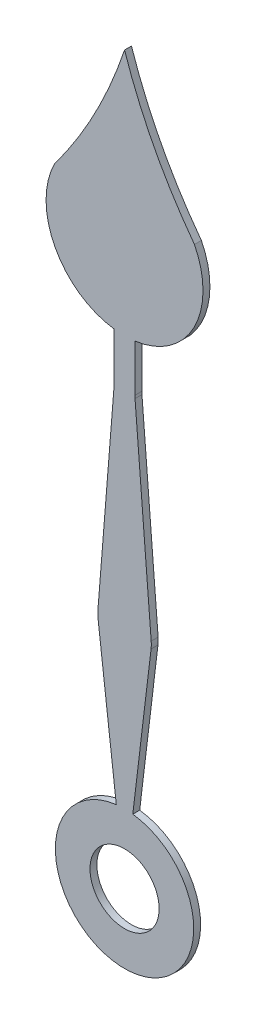
ISO-10303-21;
HEADER;
FILE_DESCRIPTION(('STEP AP214'),'2;1');
FILE_NAME('part.step','',(''),(''),'','','');
FILE_SCHEMA(('AUTOMOTIVE_DESIGN { 1 0 10303 214 1 1 1 1 }'));
ENDSEC;
DATA;
#1=APPLICATION_CONTEXT('core data for automotive mechanical design processes');
#2=APPLICATION_PROTOCOL_DEFINITION('international standard','automotive_design',2000,#1);
#3=PRODUCT_CONTEXT('',#1,'mechanical');
#4=PRODUCT('Part','Part','',(#3));
#5=PRODUCT_RELATED_PRODUCT_CATEGORY('part','',(#4));
#6=PRODUCT_DEFINITION_FORMATION('','',#4);
#7=PRODUCT_DEFINITION_CONTEXT('part definition',#1,'design');
#8=PRODUCT_DEFINITION('design','',#6,#7);
#9=PRODUCT_DEFINITION_SHAPE('','',#8);
#10=(LENGTH_UNIT() NAMED_UNIT(*) SI_UNIT(.MILLI.,.METRE.));
#11=(NAMED_UNIT(*) PLANE_ANGLE_UNIT() SI_UNIT($,.RADIAN.));
#12=(NAMED_UNIT(*) SI_UNIT($,.STERADIAN.) SOLID_ANGLE_UNIT());
#13=UNCERTAINTY_MEASURE_WITH_UNIT(LENGTH_MEASURE(1.E-05),#10,'distance_accuracy_value','');
#14=(GEOMETRIC_REPRESENTATION_CONTEXT(3) GLOBAL_UNCERTAINTY_ASSIGNED_CONTEXT((#13)) GLOBAL_UNIT_ASSIGNED_CONTEXT((#10,
#11,#12)) REPRESENTATION_CONTEXT('',''));
#15=CARTESIAN_POINT('',(0.,0.,0.));
#16=DIRECTION('',(0.,0.,1.));
#17=DIRECTION('',(1.,0.,0.));
#18=AXIS2_PLACEMENT_3D('',#15,#16,#17);
#19=CARTESIAN_POINT('',(12.9954220080142,25.3498386594847,0.2));
#20=DIRECTION('',(0.,0.,-1.));
#21=DIRECTION('',(-1.,0.,0.));
#22=AXIS2_PLACEMENT_3D('',#19,#20,#21);
#23=PLANE('',#22);
#24=CARTESIAN_POINT('',(12.9954220080142,25.3498386594847,0.2));
#25=DIRECTION('',(0.,0.,-1.));
#26=DIRECTION('',(-1.,0.,0.));
#27=AXIS2_PLACEMENT_3D('',#24,#25,#26);
#28=CIRCLE('',#27,13.7040902481678);
#29=CARTESIAN_POINT('',(2.02038190791779,17.1430984825811,0.2));
#30=VERTEX_POINT('',#29);
#31=CARTESIAN_POINT('',(0.,21.,0.2));
#32=VERTEX_POINT('',#31);
#33=EDGE_CURVE('E200',#30,#32,#28,.T.);
#34=ORIENTED_EDGE('',*,*,#33,.T.);
#35=CARTESIAN_POINT('',(-12.9954220080142,25.3498386594847,0.2));
#36=DIRECTION('',(0.,0.,-1.));
#37=DIRECTION('',(1.,0.,0.));
#38=AXIS2_PLACEMENT_3D('',#35,#36,#37);
#39=CIRCLE('',#38,13.7040902481678);
#40=CARTESIAN_POINT('',(-2.0203819079178,17.1430984825811,0.2));
#41=VERTEX_POINT('',#40);
#42=EDGE_CURVE('E113',#32,#41,#39,.T.);
#43=ORIENTED_EDGE('',*,*,#42,.T.);
#44=CARTESIAN_POINT('',(0.,16.111505708875,0.2));
#45=DIRECTION('',(0.,0.,1.));
#46=DIRECTION('',(1.,0.,0.));
#47=AXIS2_PLACEMENT_3D('',#44,#45,#46);
#48=CIRCLE('',#47,2.26850759412533);
#49=CARTESIAN_POINT('',(-0.300000000000001,13.8629224427707,0.2));
#50=VERTEX_POINT('',#49);
#51=EDGE_CURVE('E236',#41,#50,#48,.T.);
#52=ORIENTED_EDGE('',*,*,#51,.T.);
#53=DIRECTION('',(0.,-1.,0.));
#54=VECTOR('',#53,1.);
#55=CARTESIAN_POINT('',(-0.3,12.5038116070601,0.2));
#56=LINE('',#55,#54);
#57=CARTESIAN_POINT('',(-0.3,12.5038116070601,0.2));
#58=VERTEX_POINT('',#57);
#59=EDGE_CURVE('E255',#50,#58,#56,.T.);
#60=ORIENTED_EDGE('',*,*,#59,.T.);
#61=CARTESIAN_POINT('',(-1.3,12.5038116070601,0.2));
#62=DIRECTION('',(0.,0.,-1.));
#63=DIRECTION('',(1.,0.,0.));
#64=AXIS2_PLACEMENT_3D('',#61,#62,#63);
#65=CIRCLE('',#64,1.);
#66=CARTESIAN_POINT('',(-0.303191423567273,12.4239826527254,0.2));
#67=VERTEX_POINT('',#66);
#68=EDGE_CURVE('E252',#58,#67,#65,.T.);
#69=ORIENTED_EDGE('',*,*,#68,.T.);
#70=DIRECTION('',(-0.0798289543346367,-0.996808576432726,0.));
#71=VECTOR('',#70,1.);
#72=CARTESIAN_POINT('',(-0.770758369811513,6.58556542732912,0.2));
#73=LINE('',#72,#71);
#74=CARTESIAN_POINT('',(-0.770758369811513,6.58556542732912,0.2));
#75=VERTEX_POINT('',#74);
#76=EDGE_CURVE('E254',#67,#75,#73,.T.);
#77=ORIENTED_EDGE('',*,*,#76,.T.);
#78=CARTESIAN_POINT('',(0.226050206621213,6.50573647299449,0.2));
#79=DIRECTION('',(0.,0.,1.));
#80=DIRECTION('',(-1.,0.,0.));
#81=AXIS2_PLACEMENT_3D('',#78,#79,#80);
#82=CIRCLE('',#81,1.);
#83=CARTESIAN_POINT('',(-0.766818617154049,6.38652448209119,0.2));
#84=VERTEX_POINT('',#83);
#85=EDGE_CURVE('E257',#75,#84,#82,.T.);
#86=ORIENTED_EDGE('',*,*,#85,.T.);
#87=DIRECTION('',(0.119211990903293,-0.992868823775262,0.));
#88=VECTOR('',#87,1.);
#89=CARTESIAN_POINT('',(-0.238423981806586,1.98573764755052,0.2));
#90=LINE('',#89,#88);
#91=CARTESIAN_POINT('',(-0.238423981806586,1.98573764755052,0.2));
#92=VERTEX_POINT('',#91);
#93=EDGE_CURVE('E263',#84,#92,#90,.T.);
#94=ORIENTED_EDGE('',*,*,#93,.T.);
#95=CARTESIAN_POINT('',(0.,0.,0.2));
#96=DIRECTION('',(0.,0.,1.));
#97=DIRECTION('',(1.,0.,0.));
#98=AXIS2_PLACEMENT_3D('',#95,#96,#97);
#99=CIRCLE('',#98,2.);
#100=CARTESIAN_POINT('',(0.238423981806585,1.98573764755052,0.2));
#101=VERTEX_POINT('',#100);
#102=EDGE_CURVE('E265',#92,#101,#99,.T.);
#103=ORIENTED_EDGE('',*,*,#102,.T.);
#104=DIRECTION('',(0.119211990903293,0.992868823775262,0.));
#105=VECTOR('',#104,1.);
#106=CARTESIAN_POINT('',(0.238423981806586,1.98573764755052,0.2));
#107=LINE('',#106,#105);
#108=CARTESIAN_POINT('',(0.766818617154049,6.38652448209119,0.2));
#109=VERTEX_POINT('',#108);
#110=EDGE_CURVE('E267',#101,#109,#107,.T.);
#111=ORIENTED_EDGE('',*,*,#110,.T.);
#112=CARTESIAN_POINT('',(-0.226050206621213,6.50573647299449,0.2));
#113=DIRECTION('',(0.,0.,1.));
#114=DIRECTION('',(1.,0.,0.));
#115=AXIS2_PLACEMENT_3D('',#112,#113,#114);
#116=CIRCLE('',#115,1.);
#117=CARTESIAN_POINT('',(0.770758369811513,6.58556542732912,0.2));
#118=VERTEX_POINT('',#117);
#119=EDGE_CURVE('E269',#109,#118,#116,.T.);
#120=ORIENTED_EDGE('',*,*,#119,.T.);
#121=DIRECTION('',(-0.0798289543346367,0.996808576432726,0.));
#122=VECTOR('',#121,1.);
#123=CARTESIAN_POINT('',(0.770758369811513,6.58556542732912,0.2));
#124=LINE('',#123,#122);
#125=CARTESIAN_POINT('',(0.303191423567274,12.4239826527254,0.2));
#126=VERTEX_POINT('',#125);
#127=EDGE_CURVE('E153',#118,#126,#124,.T.);
#128=ORIENTED_EDGE('',*,*,#127,.T.);
#129=CARTESIAN_POINT('',(1.3,12.5038116070601,0.2));
#130=DIRECTION('',(0.,0.,-1.));
#131=DIRECTION('',(-1.,0.,0.));
#132=AXIS2_PLACEMENT_3D('',#129,#130,#131);
#133=CIRCLE('',#132,1.);
#134=CARTESIAN_POINT('',(0.3,12.5038116070601,0.2));
#135=VERTEX_POINT('',#134);
#136=EDGE_CURVE('E147',#126,#135,#133,.T.);
#137=ORIENTED_EDGE('',*,*,#136,.T.);
#138=DIRECTION('',(0.,1.,0.));
#139=VECTOR('',#138,1.);
#140=CARTESIAN_POINT('',(0.3,12.5038116070601,0.2));
#141=LINE('',#140,#139);
#142=CARTESIAN_POINT('',(0.3,13.8629224427707,0.2));
#143=VERTEX_POINT('',#142);
#144=EDGE_CURVE('E151',#135,#143,#141,.T.);
#145=ORIENTED_EDGE('',*,*,#144,.T.);
#146=CARTESIAN_POINT('',(0.,16.111505708875,0.2));
#147=DIRECTION('',(0.,0.,1.));
#148=DIRECTION('',(-1.,0.,0.));
#149=AXIS2_PLACEMENT_3D('',#146,#147,#148);
#150=CIRCLE('',#149,2.26850759412533);
#151=EDGE_CURVE('E49',#143,#30,#150,.T.);
#152=ORIENTED_EDGE('',*,*,#151,.T.);
#153=EDGE_LOOP('',(#34,#43,#52,#60,#69,#77,#86,#94,#103,#111,#120,#128,#137,#145,#152));
#154=FACE_BOUND('',#153,.T.);
#155=CARTESIAN_POINT('',(0.,0.,0.2));
#156=DIRECTION('',(0.,0.,1.));
#157=DIRECTION('',(1.,0.,0.));
#158=AXIS2_PLACEMENT_3D('',#155,#156,#157);
#159=CIRCLE('',#158,1.);
#160=CARTESIAN_POINT('',(1.,0.,0.2));
#161=VERTEX_POINT('',#160);
#162=EDGE_CURVE('E175',#161,#161,#159,.T.);
#163=ORIENTED_EDGE('',*,*,#162,.F.);
#164=EDGE_LOOP('',(#163));
#165=FACE_BOUND('',#164,.T.);
#166=ADVANCED_FACE('F32',(#154,#165),#23,.F.);
#167=CARTESIAN_POINT('',(12.9954220080142,25.3498386594847,0.));
#168=DIRECTION('',(0.,0.,-1.));
#169=DIRECTION('',(-1.,0.,0.));
#170=AXIS2_PLACEMENT_3D('',#167,#168,#169);
#171=PLANE('',#170);
#172=CARTESIAN_POINT('',(12.9954220080142,25.3498386594847,0.));
#173=DIRECTION('',(0.,0.,-1.));
#174=DIRECTION('',(-1.,0.,0.));
#175=AXIS2_PLACEMENT_3D('',#172,#173,#174);
#176=CIRCLE('',#175,13.7040902481678);
#177=CARTESIAN_POINT('',(2.02038190791779,17.1430984825811,0.));
#178=VERTEX_POINT('',#177);
#179=CARTESIAN_POINT('',(0.,21.,0.));
#180=VERTEX_POINT('',#179);
#181=EDGE_CURVE('E171',#178,#180,#176,.T.);
#182=ORIENTED_EDGE('',*,*,#181,.F.);
#183=CARTESIAN_POINT('',(0.,16.111505708875,0.));
#184=DIRECTION('',(0.,0.,1.));
#185=DIRECTION('',(-1.,0.,0.));
#186=AXIS2_PLACEMENT_3D('',#183,#184,#185);
#187=CIRCLE('',#186,2.26850759412533);
#188=CARTESIAN_POINT('',(0.3,13.8629224427707,0.));
#189=VERTEX_POINT('',#188);
#190=EDGE_CURVE('E105',#189,#178,#187,.T.);
#191=ORIENTED_EDGE('',*,*,#190,.F.);
#192=DIRECTION('',(0.,1.,0.));
#193=VECTOR('',#192,1.);
#194=CARTESIAN_POINT('',(0.3,12.5038116070601,0.));
#195=LINE('',#194,#193);
#196=CARTESIAN_POINT('',(0.3,12.5038116070601,0.));
#197=VERTEX_POINT('',#196);
#198=EDGE_CURVE('E99',#197,#189,#195,.T.);
#199=ORIENTED_EDGE('',*,*,#198,.F.);
#200=CARTESIAN_POINT('',(1.3,12.5038116070601,0.));
#201=DIRECTION('',(0.,0.,-1.));
#202=DIRECTION('',(-1.,0.,0.));
#203=AXIS2_PLACEMENT_3D('',#200,#201,#202);
#204=CIRCLE('',#203,1.);
#205=CARTESIAN_POINT('',(0.303191423567274,12.4239826527254,0.));
#206=VERTEX_POINT('',#205);
#207=EDGE_CURVE('E161',#206,#197,#204,.T.);
#208=ORIENTED_EDGE('',*,*,#207,.F.);
#209=DIRECTION('',(-0.0798289543346367,0.996808576432726,0.));
#210=VECTOR('',#209,1.);
#211=CARTESIAN_POINT('',(0.770758369811513,6.58556542732912,0.));
#212=LINE('',#211,#210);
#213=CARTESIAN_POINT('',(0.770758369811513,6.58556542732912,0.));
#214=VERTEX_POINT('',#213);
#215=EDGE_CURVE('E195',#214,#206,#212,.T.);
#216=ORIENTED_EDGE('',*,*,#215,.F.);
#217=CARTESIAN_POINT('',(-0.226050206621213,6.50573647299449,0.));
#218=DIRECTION('',(0.,0.,1.));
#219=DIRECTION('',(1.,0.,0.));
#220=AXIS2_PLACEMENT_3D('',#217,#218,#219);
#221=CIRCLE('',#220,1.);
#222=CARTESIAN_POINT('',(0.766818617154049,6.38652448209119,0.));
#223=VERTEX_POINT('',#222);
#224=EDGE_CURVE('E193',#223,#214,#221,.T.);
#225=ORIENTED_EDGE('',*,*,#224,.F.);
#226=DIRECTION('',(0.119211990903293,0.992868823775262,0.));
#227=VECTOR('',#226,1.);
#228=CARTESIAN_POINT('',(0.238423981806586,1.98573764755052,0.));
#229=LINE('',#228,#227);
#230=CARTESIAN_POINT('',(0.238423981806585,1.98573764755052,0.));
#231=VERTEX_POINT('',#230);
#232=EDGE_CURVE('E191',#231,#223,#229,.T.);
#233=ORIENTED_EDGE('',*,*,#232,.F.);
#234=CARTESIAN_POINT('',(0.,0.,0.));
#235=DIRECTION('',(0.,0.,1.));
#236=DIRECTION('',(1.,0.,0.));
#237=AXIS2_PLACEMENT_3D('',#234,#235,#236);
#238=CIRCLE('',#237,2.);
#239=CARTESIAN_POINT('',(-0.238423981806586,1.98573764755052,0.));
#240=VERTEX_POINT('',#239);
#241=EDGE_CURVE('E189',#240,#231,#238,.T.);
#242=ORIENTED_EDGE('',*,*,#241,.F.);
#243=DIRECTION('',(0.119211990903293,-0.992868823775262,0.));
#244=VECTOR('',#243,1.);
#245=CARTESIAN_POINT('',(-0.238423981806586,1.98573764755052,0.));
#246=LINE('',#245,#244);
#247=CARTESIAN_POINT('',(-0.766818617154049,6.38652448209119,0.));
#248=VERTEX_POINT('',#247);
#249=EDGE_CURVE('E187',#248,#240,#246,.T.);
#250=ORIENTED_EDGE('',*,*,#249,.F.);
#251=CARTESIAN_POINT('',(0.226050206621213,6.50573647299449,0.));
#252=DIRECTION('',(0.,0.,1.));
#253=DIRECTION('',(-1.,0.,0.));
#254=AXIS2_PLACEMENT_3D('',#251,#252,#253);
#255=CIRCLE('',#254,1.);
#256=CARTESIAN_POINT('',(-0.770758369811513,6.58556542732912,0.));
#257=VERTEX_POINT('',#256);
#258=EDGE_CURVE('E185',#257,#248,#255,.T.);
#259=ORIENTED_EDGE('',*,*,#258,.F.);
#260=DIRECTION('',(-0.0798289543346367,-0.996808576432726,0.));
#261=VECTOR('',#260,1.);
#262=CARTESIAN_POINT('',(-0.770758369811513,6.58556542732912,0.));
#263=LINE('',#262,#261);
#264=CARTESIAN_POINT('',(-0.303191423567273,12.4239826527254,0.));
#265=VERTEX_POINT('',#264);
#266=EDGE_CURVE('E183',#265,#257,#263,.T.);
#267=ORIENTED_EDGE('',*,*,#266,.F.);
#268=CARTESIAN_POINT('',(-1.3,12.5038116070601,0.));
#269=DIRECTION('',(0.,0.,-1.));
#270=DIRECTION('',(1.,0.,0.));
#271=AXIS2_PLACEMENT_3D('',#268,#269,#270);
#272=CIRCLE('',#271,1.);
#273=CARTESIAN_POINT('',(-0.3,12.5038116070601,0.));
#274=VERTEX_POINT('',#273);
#275=EDGE_CURVE('E181',#274,#265,#272,.T.);
#276=ORIENTED_EDGE('',*,*,#275,.F.);
#277=DIRECTION('',(0.,-1.,0.));
#278=VECTOR('',#277,1.);
#279=CARTESIAN_POINT('',(-0.3,12.5038116070601,0.));
#280=LINE('',#279,#278);
#281=CARTESIAN_POINT('',(-0.300000000000001,13.8629224427707,0.));
#282=VERTEX_POINT('',#281);
#283=EDGE_CURVE('E179',#282,#274,#280,.T.);
#284=ORIENTED_EDGE('',*,*,#283,.F.);
#285=CARTESIAN_POINT('',(0.,16.111505708875,0.));
#286=DIRECTION('',(0.,0.,1.));
#287=DIRECTION('',(1.,0.,0.));
#288=AXIS2_PLACEMENT_3D('',#285,#286,#287);
#289=CIRCLE('',#288,2.26850759412533);
#290=CARTESIAN_POINT('',(-2.0203819079178,17.1430984825811,0.));
#291=VERTEX_POINT('',#290);
#292=EDGE_CURVE('E177',#291,#282,#289,.T.);
#293=ORIENTED_EDGE('',*,*,#292,.F.);
#294=CARTESIAN_POINT('',(-12.9954220080142,25.3498386594847,0.));
#295=DIRECTION('',(0.,0.,-1.));
#296=DIRECTION('',(1.,0.,0.));
#297=AXIS2_PLACEMENT_3D('',#294,#295,#296);
#298=CIRCLE('',#297,13.7040902481678);
#299=EDGE_CURVE('E174',#180,#291,#298,.T.);
#300=ORIENTED_EDGE('',*,*,#299,.F.);
#301=EDGE_LOOP('',(#182,#191,#199,#208,#216,#225,#233,#242,#250,#259,#267,#276,#284,#293,#300));
#302=FACE_BOUND('',#301,.T.);
#303=CARTESIAN_POINT('',(0.,0.,0.));
#304=DIRECTION('',(0.,0.,1.));
#305=DIRECTION('',(1.,0.,0.));
#306=AXIS2_PLACEMENT_3D('',#303,#304,#305);
#307=CIRCLE('',#306,1.);
#308=CARTESIAN_POINT('',(1.,0.,0.));
#309=VERTEX_POINT('',#308);
#310=EDGE_CURVE('E455',#309,#309,#307,.T.);
#311=ORIENTED_EDGE('',*,*,#310,.T.);
#312=EDGE_LOOP('',(#311));
#313=FACE_BOUND('',#312,.T.);
#314=ADVANCED_FACE('F240',(#302,#313),#171,.T.);
#315=CARTESIAN_POINT('',(12.9954220080142,25.3498386594847,0.2));
#316=DIRECTION('',(0.,0.,-1.));
#317=DIRECTION('',(-1.,0.,0.));
#318=AXIS2_PLACEMENT_3D('',#315,#316,#317);
#319=CYLINDRICAL_SURFACE('',#318,13.7040902481678);
#320=ORIENTED_EDGE('',*,*,#181,.T.);
#321=DIRECTION('',(0.,0.,-1.));
#322=VECTOR('',#321,1.);
#323=CARTESIAN_POINT('',(0.,21.,0.2));
#324=LINE('',#323,#322);
#325=EDGE_CURVE('E11',#32,#180,#324,.T.);
#326=ORIENTED_EDGE('',*,*,#325,.F.);
#327=ORIENTED_EDGE('',*,*,#33,.F.);
#328=DIRECTION('',(0.,0.,-1.));
#329=VECTOR('',#328,1.);
#330=CARTESIAN_POINT('',(2.02038190791779,17.1430984825811,0.2));
#331=LINE('',#330,#329);
#332=EDGE_CURVE('E167',#30,#178,#331,.T.);
#333=ORIENTED_EDGE('',*,*,#332,.T.);
#334=EDGE_LOOP('',(#320,#326,#327,#333));
#335=FACE_BOUND('',#334,.T.);
#336=ADVANCED_FACE('F34',(#335),#319,.F.);
#337=CARTESIAN_POINT('',(-12.9954220080142,25.3498386594847,0.2));
#338=DIRECTION('',(0.,0.,-1.));
#339=DIRECTION('',(-1.,0.,0.));
#340=AXIS2_PLACEMENT_3D('',#337,#338,#339);
#341=CYLINDRICAL_SURFACE('',#340,13.7040902481678);
#342=ORIENTED_EDGE('',*,*,#299,.T.);
#343=DIRECTION('',(0.,0.,-1.));
#344=VECTOR('',#343,1.);
#345=CARTESIAN_POINT('',(-2.0203819079178,17.1430984825811,0.2));
#346=LINE('',#345,#344);
#347=EDGE_CURVE('E41',#41,#291,#346,.T.);
#348=ORIENTED_EDGE('',*,*,#347,.F.);
#349=ORIENTED_EDGE('',*,*,#42,.F.);
#350=ORIENTED_EDGE('',*,*,#325,.T.);
#351=EDGE_LOOP('',(#342,#348,#349,#350));
#352=FACE_BOUND('',#351,.T.);
#353=ADVANCED_FACE('F303',(#352),#341,.F.);
#354=CARTESIAN_POINT('',(0.,16.111505708875,0.2));
#355=DIRECTION('',(0.,0.,-1.));
#356=DIRECTION('',(-1.,0.,0.));
#357=AXIS2_PLACEMENT_3D('',#354,#355,#356);
#358=CYLINDRICAL_SURFACE('',#357,2.26850759412533);
#359=ORIENTED_EDGE('',*,*,#292,.T.);
#360=DIRECTION('',(0.,0.,-1.));
#361=VECTOR('',#360,1.);
#362=CARTESIAN_POINT('',(-0.300000000000001,13.8629224427707,0.2));
#363=LINE('',#362,#361);
#364=EDGE_CURVE('E228',#50,#282,#363,.T.);
#365=ORIENTED_EDGE('',*,*,#364,.F.);
#366=ORIENTED_EDGE('',*,*,#51,.F.);
#367=ORIENTED_EDGE('',*,*,#347,.T.);
#368=EDGE_LOOP('',(#359,#365,#366,#367));
#369=FACE_BOUND('',#368,.T.);
#370=ADVANCED_FACE('F234',(#369),#358,.T.);
#371=CARTESIAN_POINT('',(-0.3,12.5038116070601,0.2));
#372=DIRECTION('',(1.,0.,0.));
#373=DIRECTION('',(0.,1.,0.));
#374=AXIS2_PLACEMENT_3D('',#371,#372,#373);
#375=PLANE('',#374);
#376=ORIENTED_EDGE('',*,*,#283,.T.);
#377=DIRECTION('',(0.,0.,-1.));
#378=VECTOR('',#377,1.);
#379=CARTESIAN_POINT('',(-0.3,12.5038116070601,0.2));
#380=LINE('',#379,#378);
#381=EDGE_CURVE('E225',#58,#274,#380,.T.);
#382=ORIENTED_EDGE('',*,*,#381,.F.);
#383=ORIENTED_EDGE('',*,*,#59,.F.);
#384=ORIENTED_EDGE('',*,*,#364,.T.);
#385=EDGE_LOOP('',(#376,#382,#383,#384));
#386=FACE_BOUND('',#385,.T.);
#387=ADVANCED_FACE('F246',(#386),#375,.F.);
#388=CARTESIAN_POINT('',(-1.3,12.5038116070601,0.2));
#389=DIRECTION('',(0.,0.,-1.));
#390=DIRECTION('',(-1.,0.,0.));
#391=AXIS2_PLACEMENT_3D('',#388,#389,#390);
#392=CYLINDRICAL_SURFACE('',#391,1.);
#393=ORIENTED_EDGE('',*,*,#275,.T.);
#394=DIRECTION('',(0.,0.,-1.));
#395=VECTOR('',#394,1.);
#396=CARTESIAN_POINT('',(-0.303191423567273,12.4239826527254,0.2));
#397=LINE('',#396,#395);
#398=EDGE_CURVE('E222',#67,#265,#397,.T.);
#399=ORIENTED_EDGE('',*,*,#398,.F.);
#400=ORIENTED_EDGE('',*,*,#68,.F.);
#401=ORIENTED_EDGE('',*,*,#381,.T.);
#402=EDGE_LOOP('',(#393,#399,#400,#401));
#403=FACE_BOUND('',#402,.T.);
#404=ADVANCED_FACE('F250',(#403),#392,.F.);
#405=CARTESIAN_POINT('',(-0.770758369811513,6.58556542732912,0.2));
#406=DIRECTION('',(0.996808576432726,-0.0798289543346367,0.));
#407=DIRECTION('',(0.0798289543346367,0.996808576432726,0.));
#408=AXIS2_PLACEMENT_3D('',#405,#406,#407);
#409=PLANE('',#408);
#410=ORIENTED_EDGE('',*,*,#266,.T.);
#411=DIRECTION('',(0.,0.,-1.));
#412=VECTOR('',#411,1.);
#413=CARTESIAN_POINT('',(-0.770758369811513,6.58556542732912,0.2));
#414=LINE('',#413,#412);
#415=EDGE_CURVE('E219',#75,#257,#414,.T.);
#416=ORIENTED_EDGE('',*,*,#415,.F.);
#417=ORIENTED_EDGE('',*,*,#76,.F.);
#418=ORIENTED_EDGE('',*,*,#398,.T.);
#419=EDGE_LOOP('',(#410,#416,#417,#418));
#420=FACE_BOUND('',#419,.T.);
#421=ADVANCED_FACE('F316',(#420),#409,.F.);
#422=CARTESIAN_POINT('',(0.226050206621213,6.50573647299449,0.2));
#423=DIRECTION('',(0.,0.,-1.));
#424=DIRECTION('',(-1.,0.,0.));
#425=AXIS2_PLACEMENT_3D('',#422,#423,#424);
#426=CYLINDRICAL_SURFACE('',#425,1.);
#427=ORIENTED_EDGE('',*,*,#258,.T.);
#428=DIRECTION('',(0.,0.,-1.));
#429=VECTOR('',#428,1.);
#430=CARTESIAN_POINT('',(-0.766818617154049,6.38652448209119,0.2));
#431=LINE('',#430,#429);
#432=EDGE_CURVE('E216',#84,#248,#431,.T.);
#433=ORIENTED_EDGE('',*,*,#432,.F.);
#434=ORIENTED_EDGE('',*,*,#85,.F.);
#435=ORIENTED_EDGE('',*,*,#415,.T.);
#436=EDGE_LOOP('',(#427,#433,#434,#435));
#437=FACE_BOUND('',#436,.T.);
#438=ADVANCED_FACE('F319',(#437),#426,.T.);
#439=CARTESIAN_POINT('',(-0.238423981806586,1.98573764755052,0.2));
#440=DIRECTION('',(0.992868823775262,0.119211990903293,0.));
#441=DIRECTION('',(-0.119211990903293,0.992868823775262,0.));
#442=AXIS2_PLACEMENT_3D('',#439,#440,#441);
#443=PLANE('',#442);
#444=ORIENTED_EDGE('',*,*,#249,.T.);
#445=DIRECTION('',(0.,0.,-1.));
#446=VECTOR('',#445,1.);
#447=CARTESIAN_POINT('',(-0.238423981806586,1.98573764755052,0.2));
#448=LINE('',#447,#446);
#449=EDGE_CURVE('E213',#92,#240,#448,.T.);
#450=ORIENTED_EDGE('',*,*,#449,.F.);
#451=ORIENTED_EDGE('',*,*,#93,.F.);
#452=ORIENTED_EDGE('',*,*,#432,.T.);
#453=EDGE_LOOP('',(#444,#450,#451,#452));
#454=FACE_BOUND('',#453,.T.);
#455=ADVANCED_FACE('F323',(#454),#443,.F.);
#456=CARTESIAN_POINT('',(0.,0.,0.2));
#457=DIRECTION('',(0.,0.,-1.));
#458=DIRECTION('',(-1.,0.,0.));
#459=AXIS2_PLACEMENT_3D('',#456,#457,#458);
#460=CYLINDRICAL_SURFACE('',#459,2.);
#461=ORIENTED_EDGE('',*,*,#241,.T.);
#462=DIRECTION('',(0.,0.,-1.));
#463=VECTOR('',#462,1.);
#464=CARTESIAN_POINT('',(0.238423981806585,1.98573764755052,0.2));
#465=LINE('',#464,#463);
#466=EDGE_CURVE('E210',#101,#231,#465,.T.);
#467=ORIENTED_EDGE('',*,*,#466,.F.);
#468=ORIENTED_EDGE('',*,*,#102,.F.);
#469=ORIENTED_EDGE('',*,*,#449,.T.);
#470=EDGE_LOOP('',(#461,#467,#468,#469));
#471=FACE_BOUND('',#470,.T.);
#472=ADVANCED_FACE('F327',(#471),#460,.T.);
#473=CARTESIAN_POINT('',(0.238423981806586,1.98573764755052,0.2));
#474=DIRECTION('',(-0.992868823775262,0.119211990903293,0.));
#475=DIRECTION('',(-0.119211990903293,-0.992868823775262,0.));
#476=AXIS2_PLACEMENT_3D('',#473,#474,#475);
#477=PLANE('',#476);
#478=ORIENTED_EDGE('',*,*,#232,.T.);
#479=DIRECTION('',(0.,0.,-1.));
#480=VECTOR('',#479,1.);
#481=CARTESIAN_POINT('',(0.766818617154049,6.38652448209119,0.2));
#482=LINE('',#481,#480);
#483=EDGE_CURVE('E207',#109,#223,#482,.T.);
#484=ORIENTED_EDGE('',*,*,#483,.F.);
#485=ORIENTED_EDGE('',*,*,#110,.F.);
#486=ORIENTED_EDGE('',*,*,#466,.T.);
#487=EDGE_LOOP('',(#478,#484,#485,#486));
#488=FACE_BOUND('',#487,.T.);
#489=ADVANCED_FACE('F331',(#488),#477,.F.);
#490=CARTESIAN_POINT('',(-0.226050206621213,6.50573647299449,0.2));
#491=DIRECTION('',(0.,0.,-1.));
#492=DIRECTION('',(-1.,0.,0.));
#493=AXIS2_PLACEMENT_3D('',#490,#491,#492);
#494=CYLINDRICAL_SURFACE('',#493,1.);
#495=ORIENTED_EDGE('',*,*,#224,.T.);
#496=DIRECTION('',(0.,0.,-1.));
#497=VECTOR('',#496,1.);
#498=CARTESIAN_POINT('',(0.770758369811513,6.58556542732912,0.2));
#499=LINE('',#498,#497);
#500=EDGE_CURVE('E204',#118,#214,#499,.T.);
#501=ORIENTED_EDGE('',*,*,#500,.F.);
#502=ORIENTED_EDGE('',*,*,#119,.F.);
#503=ORIENTED_EDGE('',*,*,#483,.T.);
#504=EDGE_LOOP('',(#495,#501,#502,#503));
#505=FACE_BOUND('',#504,.T.);
#506=ADVANCED_FACE('F275',(#505),#494,.T.);
#507=CARTESIAN_POINT('',(0.770758369811513,6.58556542732912,0.2));
#508=DIRECTION('',(-0.996808576432726,-0.0798289543346367,0.));
#509=DIRECTION('',(0.0798289543346367,-0.996808576432726,0.));
#510=AXIS2_PLACEMENT_3D('',#507,#508,#509);
#511=PLANE('',#510);
#512=ORIENTED_EDGE('',*,*,#215,.T.);
#513=DIRECTION('',(0.,0.,-1.));
#514=VECTOR('',#513,1.);
#515=CARTESIAN_POINT('',(0.303191423567274,12.4239826527254,0.2));
#516=LINE('',#515,#514);
#517=EDGE_CURVE('E162',#126,#206,#516,.T.);
#518=ORIENTED_EDGE('',*,*,#517,.F.);
#519=ORIENTED_EDGE('',*,*,#127,.F.);
#520=ORIENTED_EDGE('',*,*,#500,.T.);
#521=EDGE_LOOP('',(#512,#518,#519,#520));
#522=FACE_BOUND('',#521,.T.);
#523=ADVANCED_FACE('F279',(#522),#511,.F.);
#524=CARTESIAN_POINT('',(1.3,12.5038116070601,0.2));
#525=DIRECTION('',(0.,0.,-1.));
#526=DIRECTION('',(-1.,0.,0.));
#527=AXIS2_PLACEMENT_3D('',#524,#525,#526);
#528=CYLINDRICAL_SURFACE('',#527,1.);
#529=ORIENTED_EDGE('',*,*,#207,.T.);
#530=DIRECTION('',(0.,0.,-1.));
#531=VECTOR('',#530,1.);
#532=CARTESIAN_POINT('',(0.3,12.5038116070601,0.2));
#533=LINE('',#532,#531);
#534=EDGE_CURVE('E158',#135,#197,#533,.T.);
#535=ORIENTED_EDGE('',*,*,#534,.F.);
#536=ORIENTED_EDGE('',*,*,#136,.F.);
#537=ORIENTED_EDGE('',*,*,#517,.T.);
#538=EDGE_LOOP('',(#529,#535,#536,#537));
#539=FACE_BOUND('',#538,.T.);
#540=ADVANCED_FACE('F159',(#539),#528,.F.);
#541=CARTESIAN_POINT('',(0.3,12.5038116070601,0.2));
#542=DIRECTION('',(-1.,0.,0.));
#543=DIRECTION('',(0.,-1.,0.));
#544=AXIS2_PLACEMENT_3D('',#541,#542,#543);
#545=PLANE('',#544);
#546=ORIENTED_EDGE('',*,*,#198,.T.);
#547=DIRECTION('',(0.,0.,-1.));
#548=VECTOR('',#547,1.);
#549=CARTESIAN_POINT('',(0.3,13.8629224427707,0.2));
#550=LINE('',#549,#548);
#551=EDGE_CURVE('E163',#143,#189,#550,.T.);
#552=ORIENTED_EDGE('',*,*,#551,.F.);
#553=ORIENTED_EDGE('',*,*,#144,.F.);
#554=ORIENTED_EDGE('',*,*,#534,.T.);
#555=EDGE_LOOP('',(#546,#552,#553,#554));
#556=FACE_BOUND('',#555,.T.);
#557=ADVANCED_FACE('F165',(#556),#545,.F.);
#558=CARTESIAN_POINT('',(0.,16.111505708875,0.2));
#559=DIRECTION('',(0.,0.,-1.));
#560=DIRECTION('',(-1.,0.,0.));
#561=AXIS2_PLACEMENT_3D('',#558,#559,#560);
#562=CYLINDRICAL_SURFACE('',#561,2.26850759412533);
#563=ORIENTED_EDGE('',*,*,#190,.T.);
#564=ORIENTED_EDGE('',*,*,#332,.F.);
#565=ORIENTED_EDGE('',*,*,#151,.F.);
#566=ORIENTED_EDGE('',*,*,#551,.T.);
#567=EDGE_LOOP('',(#563,#564,#565,#566));
#568=FACE_BOUND('',#567,.T.);
#569=ADVANCED_FACE('F283',(#568),#562,.T.);
#570=CARTESIAN_POINT('',(0.,0.,0.2));
#571=DIRECTION('',(0.,0.,-1.));
#572=DIRECTION('',(-1.,0.,0.));
#573=AXIS2_PLACEMENT_3D('',#570,#571,#572);
#574=CYLINDRICAL_SURFACE('',#573,1.);
#575=ORIENTED_EDGE('',*,*,#162,.T.);
#576=EDGE_LOOP('',(#575));
#577=FACE_BOUND('',#576,.T.);
#578=ORIENTED_EDGE('',*,*,#310,.F.);
#579=EDGE_LOOP('',(#578));
#580=FACE_BOUND('',#579,.T.);
#581=ADVANCED_FACE('F285',(#577,#580),#574,.F.);
#582=CLOSED_SHELL('',(#166,#314,#336,#353,#370,#387,#404,#421,#438,#455,#472,#489,#506,#523,
#540,#557,#569,#581));
#583=MANIFOLD_SOLID_BREP('B2',#582);
#584=ADVANCED_BREP_SHAPE_REPRESENTATION('',(#18,#583),#14);
#585=SHAPE_DEFINITION_REPRESENTATION(#9,#584);
ENDSEC;
END-ISO-10303-21;
